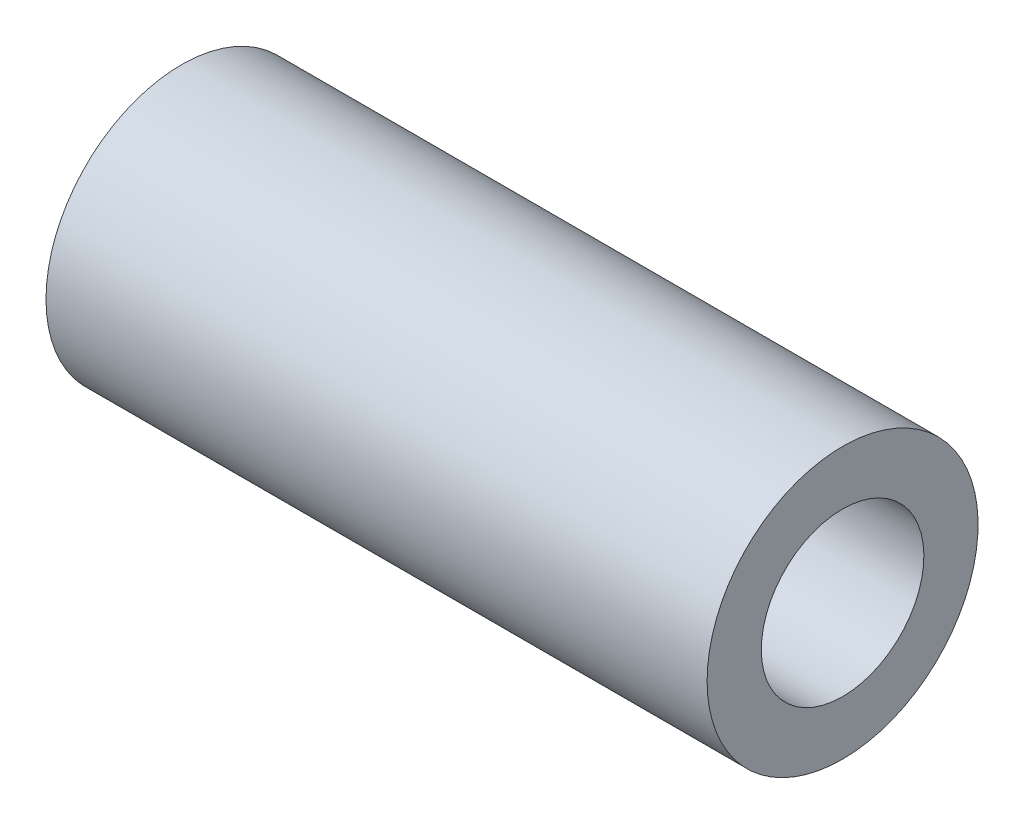
ISO-10303-21;
HEADER;
FILE_DESCRIPTION(('STEP AP214'),'2;1');
FILE_NAME('part.step','',(''),(''),'','','');
FILE_SCHEMA(('AUTOMOTIVE_DESIGN { 1 0 10303 214 1 1 1 1 }'));
ENDSEC;
DATA;
#1=APPLICATION_CONTEXT('core data for automotive mechanical design processes');
#2=APPLICATION_PROTOCOL_DEFINITION('international standard','automotive_design',2000,#1);
#3=PRODUCT_CONTEXT('',#1,'mechanical');
#4=PRODUCT('Part','Part','',(#3));
#5=PRODUCT_RELATED_PRODUCT_CATEGORY('part','',(#4));
#6=PRODUCT_DEFINITION_FORMATION('','',#4);
#7=PRODUCT_DEFINITION_CONTEXT('part definition',#1,'design');
#8=PRODUCT_DEFINITION('design','',#6,#7);
#9=PRODUCT_DEFINITION_SHAPE('','',#8);
#10=(LENGTH_UNIT() NAMED_UNIT(*) SI_UNIT(.MILLI.,.METRE.));
#11=(NAMED_UNIT(*) PLANE_ANGLE_UNIT() SI_UNIT($,.RADIAN.));
#12=(NAMED_UNIT(*) SI_UNIT($,.STERADIAN.) SOLID_ANGLE_UNIT());
#13=UNCERTAINTY_MEASURE_WITH_UNIT(LENGTH_MEASURE(1.E-05),#10,'distance_accuracy_value','');
#14=(GEOMETRIC_REPRESENTATION_CONTEXT(3) GLOBAL_UNCERTAINTY_ASSIGNED_CONTEXT((#13)) GLOBAL_UNIT_ASSIGNED_CONTEXT((#10,
#11,#12)) REPRESENTATION_CONTEXT('',''));
#15=CARTESIAN_POINT('',(0.,0.,0.));
#16=DIRECTION('',(0.,0.,1.));
#17=DIRECTION('',(1.,0.,0.));
#18=AXIS2_PLACEMENT_3D('',#15,#16,#17);
#19=CARTESIAN_POINT('',(-19.7210678118614,130.531151206331,-94.7710579745221));
#20=DIRECTION('',(1.,0.,0.));
#21=DIRECTION('',(0.,1.,0.));
#22=AXIS2_PLACEMENT_3D('',#19,#20,#21);
#23=CYLINDRICAL_SURFACE('',#22,2.49999999999859);
#24=CARTESIAN_POINT('',(-0.449999999999956,130.531151206331,-94.7710579745221));
#25=DIRECTION('',(-1.,0.,0.));
#26=DIRECTION('',(0.,-1.,0.));
#27=AXIS2_PLACEMENT_3D('',#24,#25,#26);
#28=CIRCLE('',#27,2.49999999999859);
#29=CARTESIAN_POINT('',(-0.449999999999956,128.031151206332,-94.7710579745221));
#30=VERTEX_POINT('',#29);
#31=EDGE_CURVE('E40',#30,#30,#28,.T.);
#32=ORIENTED_EDGE('',*,*,#31,.T.);
#33=EDGE_LOOP('',(#32));
#34=FACE_BOUND('',#33,.T.);
#35=CARTESIAN_POINT('',(-12.65,130.531151206331,-94.7710579745221));
#36=DIRECTION('',(-1.,0.,0.));
#37=DIRECTION('',(0.,0.,1.));
#38=AXIS2_PLACEMENT_3D('',#35,#36,#37);
#39=CIRCLE('',#38,2.49999999999859);
#40=CARTESIAN_POINT('',(-12.65,130.531151206331,-92.2710579745235));
#41=VERTEX_POINT('',#40);
#42=EDGE_CURVE('E10',#41,#41,#39,.T.);
#43=ORIENTED_EDGE('',*,*,#42,.F.);
#44=EDGE_LOOP('',(#43));
#45=FACE_BOUND('',#44,.T.);
#46=ADVANCED_FACE('F37',(#34,#45),#23,.T.);
#47=CARTESIAN_POINT('',(-0.449999999999956,130.531151206331,-94.7710579745221));
#48=DIRECTION('',(-1.,0.,0.));
#49=DIRECTION('',(0.,-1.,0.));
#50=AXIS2_PLACEMENT_3D('',#47,#48,#49);
#51=PLANE('',#50);
#52=ORIENTED_EDGE('',*,*,#31,.F.);
#53=EDGE_LOOP('',(#52));
#54=FACE_BOUND('',#53,.T.);
#55=CARTESIAN_POINT('',(-0.449999999999956,130.531151206331,-94.7710579745221));
#56=DIRECTION('',(-1.,0.,0.));
#57=DIRECTION('',(0.,-1.,0.));
#58=AXIS2_PLACEMENT_3D('',#55,#56,#57);
#59=CIRCLE('',#58,1.49999999999859);
#60=CARTESIAN_POINT('',(-0.449999999999956,129.031151206332,-94.7710579745221));
#61=VERTEX_POINT('',#60);
#62=EDGE_CURVE('E50',#61,#61,#59,.T.);
#63=ORIENTED_EDGE('',*,*,#62,.T.);
#64=EDGE_LOOP('',(#63));
#65=FACE_BOUND('',#64,.T.);
#66=ADVANCED_FACE('F59',(#54,#65),#51,.F.);
#67=CARTESIAN_POINT('',(-19.7210678118614,130.531151206331,-94.7710579745221));
#68=DIRECTION('',(1.,0.,0.));
#69=DIRECTION('',(0.,1.,0.));
#70=AXIS2_PLACEMENT_3D('',#67,#68,#69);
#71=CYLINDRICAL_SURFACE('',#70,1.49999999999859);
#72=ORIENTED_EDGE('',*,*,#62,.F.);
#73=EDGE_LOOP('',(#72));
#74=FACE_BOUND('',#73,.T.);
#75=CARTESIAN_POINT('',(-12.65,130.531151206331,-94.7710579745221));
#76=DIRECTION('',(1.,0.,0.));
#77=DIRECTION('',(0.,-0.339921946978356,-0.940453651150573));
#78=AXIS2_PLACEMENT_3D('',#75,#76,#77);
#79=CIRCLE('',#78,1.5);
#80=CARTESIAN_POINT('',(-12.65,130.021268285863,-96.1817384512479));
#81=VERTEX_POINT('',#80);
#82=EDGE_CURVE('E44',#81,#81,#79,.F.);
#83=ORIENTED_EDGE('',*,*,#82,.T.);
#84=EDGE_LOOP('',(#83));
#85=FACE_BOUND('',#84,.T.);
#86=ADVANCED_FACE('F61',(#74,#85),#71,.F.);
#87=CARTESIAN_POINT('',(-12.65,147.527248555249,-47.7483754169934));
#88=DIRECTION('',(-1.,0.,0.));
#89=DIRECTION('',(0.,-0.339921946978356,-0.940453651150573));
#90=AXIS2_PLACEMENT_3D('',#87,#88,#89);
#91=PLANE('',#90);
#92=ORIENTED_EDGE('',*,*,#82,.F.);
#93=EDGE_LOOP('',(#92));
#94=FACE_BOUND('',#93,.T.);
#95=ORIENTED_EDGE('',*,*,#42,.T.);
#96=EDGE_LOOP('',(#95));
#97=FACE_BOUND('',#96,.T.);
#98=ADVANCED_FACE('F66',(#94,#97),#91,.T.);
#99=CLOSED_SHELL('',(#46,#66,#86,#98));
#100=MANIFOLD_SOLID_BREP('B2',#99);
#101=ADVANCED_BREP_SHAPE_REPRESENTATION('',(#18,#100),#14);
#102=SHAPE_DEFINITION_REPRESENTATION(#9,#101);
ENDSEC;
END-ISO-10303-21;
